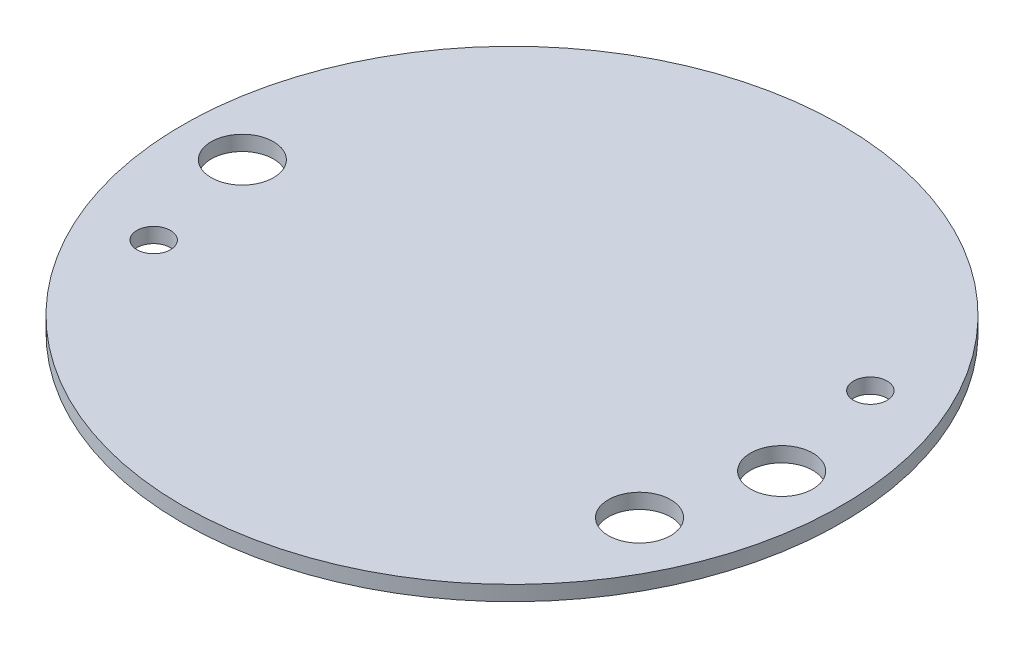
ISO-10303-21;
HEADER;
FILE_DESCRIPTION(('STEP AP214'),'2;1');
FILE_NAME('part.step','',(''),(''),'','','');
FILE_SCHEMA(('AUTOMOTIVE_DESIGN { 1 0 10303 214 1 1 1 1 }'));
ENDSEC;
DATA;
#1=APPLICATION_CONTEXT('core data for automotive mechanical design processes');
#2=APPLICATION_PROTOCOL_DEFINITION('international standard','automotive_design',2000,#1);
#3=PRODUCT_CONTEXT('',#1,'mechanical');
#4=PRODUCT('Part','Part','',(#3));
#5=PRODUCT_RELATED_PRODUCT_CATEGORY('part','',(#4));
#6=PRODUCT_DEFINITION_FORMATION('','',#4);
#7=PRODUCT_DEFINITION_CONTEXT('part definition',#1,'design');
#8=PRODUCT_DEFINITION('design','',#6,#7);
#9=PRODUCT_DEFINITION_SHAPE('','',#8);
#10=(LENGTH_UNIT() NAMED_UNIT(*) SI_UNIT(.MILLI.,.METRE.));
#11=(NAMED_UNIT(*) PLANE_ANGLE_UNIT() SI_UNIT($,.RADIAN.));
#12=(NAMED_UNIT(*) SI_UNIT($,.STERADIAN.) SOLID_ANGLE_UNIT());
#13=UNCERTAINTY_MEASURE_WITH_UNIT(LENGTH_MEASURE(1.E-05),#10,'distance_accuracy_value','');
#14=(GEOMETRIC_REPRESENTATION_CONTEXT(3) GLOBAL_UNCERTAINTY_ASSIGNED_CONTEXT((#13)) GLOBAL_UNIT_ASSIGNED_CONTEXT((#10,
#11,#12)) REPRESENTATION_CONTEXT('',''));
#15=CARTESIAN_POINT('',(0.,0.,0.));
#16=DIRECTION('',(0.,0.,1.));
#17=DIRECTION('',(1.,0.,0.));
#18=AXIS2_PLACEMENT_3D('',#15,#16,#17);
#19=CARTESIAN_POINT('',(0.,3.175,0.));
#20=DIRECTION('',(0.,-1.,0.));
#21=DIRECTION('',(0.,0.,-1.));
#22=AXIS2_PLACEMENT_3D('',#19,#20,#21);
#23=CYLINDRICAL_SURFACE('',#22,69.85);
#24=CARTESIAN_POINT('',(0.,3.175,0.));
#25=DIRECTION('',(0.,1.,0.));
#26=DIRECTION('',(0.,0.,1.));
#27=AXIS2_PLACEMENT_3D('',#24,#25,#26);
#28=CIRCLE('',#27,69.85);
#29=CARTESIAN_POINT('',(0.,3.175,69.85));
#30=VERTEX_POINT('',#29);
#31=EDGE_CURVE('E10',#30,#30,#28,.T.);
#32=ORIENTED_EDGE('',*,*,#31,.F.);
#33=EDGE_LOOP('',(#32));
#34=FACE_BOUND('',#33,.T.);
#35=CARTESIAN_POINT('',(0.,0.,0.));
#36=DIRECTION('',(0.,1.,0.));
#37=DIRECTION('',(0.,0.,1.));
#38=AXIS2_PLACEMENT_3D('',#35,#36,#37);
#39=CIRCLE('',#38,69.85);
#40=CARTESIAN_POINT('',(0.,0.,69.85));
#41=VERTEX_POINT('',#40);
#42=EDGE_CURVE('E42',#41,#41,#39,.T.);
#43=ORIENTED_EDGE('',*,*,#42,.T.);
#44=EDGE_LOOP('',(#43));
#45=FACE_BOUND('',#44,.T.);
#46=ADVANCED_FACE('F39',(#34,#45),#23,.T.);
#47=CARTESIAN_POINT('',(0.,3.175,0.));
#48=DIRECTION('',(0.,1.,0.));
#49=DIRECTION('',(0.,0.,1.));
#50=AXIS2_PLACEMENT_3D('',#47,#48,#49);
#51=PLANE('',#50);
#52=CARTESIAN_POINT('',(-57.15,3.175,0.));
#53=DIRECTION('',(0.,1.,0.));
#54=DIRECTION('',(0.,0.,1.));
#55=AXIS2_PLACEMENT_3D('',#52,#53,#54);
#56=CIRCLE('',#55,6.604);
#57=CARTESIAN_POINT('',(-57.15,3.175,6.60400000000001));
#58=VERTEX_POINT('',#57);
#59=EDGE_CURVE('E54',#58,#58,#56,.T.);
#60=ORIENTED_EDGE('',*,*,#59,.F.);
#61=EDGE_LOOP('',(#60));
#62=FACE_BOUND('',#61,.T.);
#63=CARTESIAN_POINT('',(57.15,3.175,0.));
#64=DIRECTION('',(0.,1.,0.));
#65=DIRECTION('',(0.,0.,1.));
#66=AXIS2_PLACEMENT_3D('',#63,#64,#65);
#67=CIRCLE('',#66,6.604);
#68=CARTESIAN_POINT('',(57.15,3.175,6.60399999999998));
#69=VERTEX_POINT('',#68);
#70=EDGE_CURVE('E60',#69,#69,#67,.T.);
#71=ORIENTED_EDGE('',*,*,#70,.F.);
#72=EDGE_LOOP('',(#71));
#73=FACE_BOUND('',#72,.T.);
#74=CARTESIAN_POINT('',(51.7954900291446,3.175,-24.152633658481));
#75=DIRECTION('',(0.,1.,0.));
#76=DIRECTION('',(0.,0.,1.));
#77=AXIS2_PLACEMENT_3D('',#74,#75,#76);
#78=CIRCLE('',#77,3.55600000000001);
#79=CARTESIAN_POINT('',(51.7954900291446,3.175,-20.596633658481));
#80=VERTEX_POINT('',#79);
#81=EDGE_CURVE('E61',#80,#80,#78,.T.);
#82=ORIENTED_EDGE('',*,*,#81,.F.);
#83=EDGE_LOOP('',(#82));
#84=FACE_BOUND('',#83,.T.);
#85=CARTESIAN_POINT('',(50.644479139608,3.175,23.6159084660704));
#86=DIRECTION('',(0.,1.,0.));
#87=DIRECTION('',(0.,0.,1.));
#88=AXIS2_PLACEMENT_3D('',#85,#86,#87);
#89=CIRCLE('',#88,6.604);
#90=CARTESIAN_POINT('',(50.644479139608,3.175,30.2199084660704));
#91=VERTEX_POINT('',#90);
#92=EDGE_CURVE('E72',#91,#91,#89,.T.);
#93=ORIENTED_EDGE('',*,*,#92,.F.);
#94=EDGE_LOOP('',(#93));
#95=FACE_BOUND('',#94,.T.);
#96=CARTESIAN_POINT('',(-51.7954900291446,3.175,24.1526336584811));
#97=DIRECTION('',(0.,1.,0.));
#98=DIRECTION('',(0.,0.,1.));
#99=AXIS2_PLACEMENT_3D('',#96,#97,#98);
#100=CIRCLE('',#99,3.55600000000001);
#101=CARTESIAN_POINT('',(-51.7954900291446,3.175,27.7086336584811));
#102=VERTEX_POINT('',#101);
#103=EDGE_CURVE('E51',#102,#102,#100,.T.);
#104=ORIENTED_EDGE('',*,*,#103,.F.);
#105=EDGE_LOOP('',(#104));
#106=FACE_BOUND('',#105,.T.);
#107=ORIENTED_EDGE('',*,*,#31,.T.);
#108=EDGE_LOOP('',(#107));
#109=FACE_BOUND('',#108,.T.);
#110=ADVANCED_FACE('F83',(#62,#73,#84,#95,#106,#109),#51,.T.);
#111=CARTESIAN_POINT('',(0.,0.,0.));
#112=DIRECTION('',(0.,1.,0.));
#113=DIRECTION('',(0.,0.,1.));
#114=AXIS2_PLACEMENT_3D('',#111,#112,#113);
#115=PLANE('',#114);
#116=CARTESIAN_POINT('',(-57.15,0.,0.));
#117=DIRECTION('',(0.,1.,0.));
#118=DIRECTION('',(0.,0.,1.));
#119=AXIS2_PLACEMENT_3D('',#116,#117,#118);
#120=CIRCLE('',#119,6.604);
#121=CARTESIAN_POINT('',(-57.15,0.,6.60400000000001));
#122=VERTEX_POINT('',#121);
#123=EDGE_CURVE('E64',#122,#122,#120,.T.);
#124=ORIENTED_EDGE('',*,*,#123,.T.);
#125=EDGE_LOOP('',(#124));
#126=FACE_BOUND('',#125,.T.);
#127=CARTESIAN_POINT('',(57.15,0.,0.));
#128=DIRECTION('',(0.,1.,0.));
#129=DIRECTION('',(0.,0.,1.));
#130=AXIS2_PLACEMENT_3D('',#127,#128,#129);
#131=CIRCLE('',#130,6.604);
#132=CARTESIAN_POINT('',(57.15,0.,6.60399999999998));
#133=VERTEX_POINT('',#132);
#134=EDGE_CURVE('E57',#133,#133,#131,.T.);
#135=ORIENTED_EDGE('',*,*,#134,.T.);
#136=EDGE_LOOP('',(#135));
#137=FACE_BOUND('',#136,.T.);
#138=CARTESIAN_POINT('',(51.7954900291446,0.,-24.152633658481));
#139=DIRECTION('',(0.,1.,0.));
#140=DIRECTION('',(0.,0.,1.));
#141=AXIS2_PLACEMENT_3D('',#138,#139,#140);
#142=CIRCLE('',#141,3.55600000000001);
#143=CARTESIAN_POINT('',(51.7954900291446,0.,-20.596633658481));
#144=VERTEX_POINT('',#143);
#145=EDGE_CURVE('E75',#144,#144,#142,.T.);
#146=ORIENTED_EDGE('',*,*,#145,.T.);
#147=EDGE_LOOP('',(#146));
#148=FACE_BOUND('',#147,.T.);
#149=CARTESIAN_POINT('',(50.644479139608,0.,23.6159084660704));
#150=DIRECTION('',(0.,1.,0.));
#151=DIRECTION('',(0.,0.,1.));
#152=AXIS2_PLACEMENT_3D('',#149,#150,#151);
#153=CIRCLE('',#152,6.604);
#154=CARTESIAN_POINT('',(50.644479139608,0.,30.2199084660704));
#155=VERTEX_POINT('',#154);
#156=EDGE_CURVE('E69',#155,#155,#153,.T.);
#157=ORIENTED_EDGE('',*,*,#156,.T.);
#158=EDGE_LOOP('',(#157));
#159=FACE_BOUND('',#158,.T.);
#160=CARTESIAN_POINT('',(-51.7954900291446,0.,24.1526336584811));
#161=DIRECTION('',(0.,1.,0.));
#162=DIRECTION('',(0.,0.,1.));
#163=AXIS2_PLACEMENT_3D('',#160,#161,#162);
#164=CIRCLE('',#163,3.55600000000001);
#165=CARTESIAN_POINT('',(-51.7954900291446,0.,27.7086336584811));
#166=VERTEX_POINT('',#165);
#167=EDGE_CURVE('E49',#166,#166,#164,.T.);
#168=ORIENTED_EDGE('',*,*,#167,.T.);
#169=EDGE_LOOP('',(#168));
#170=FACE_BOUND('',#169,.T.);
#171=ORIENTED_EDGE('',*,*,#42,.F.);
#172=EDGE_LOOP('',(#171));
#173=FACE_BOUND('',#172,.T.);
#174=ADVANCED_FACE('F86',(#126,#137,#148,#159,#170,#173),#115,.F.);
#175=CARTESIAN_POINT('',(-51.7954900291446,0.,24.1526336584811));
#176=DIRECTION('',(0.,1.,0.));
#177=DIRECTION('',(0.,0.,1.));
#178=AXIS2_PLACEMENT_3D('',#175,#176,#177);
#179=CYLINDRICAL_SURFACE('',#178,3.55600000000001);
#180=ORIENTED_EDGE('',*,*,#167,.F.);
#181=EDGE_LOOP('',(#180));
#182=FACE_BOUND('',#181,.T.);
#183=ORIENTED_EDGE('',*,*,#103,.T.);
#184=EDGE_LOOP('',(#183));
#185=FACE_BOUND('',#184,.T.);
#186=ADVANCED_FACE('F93',(#182,#185),#179,.F.);
#187=CARTESIAN_POINT('',(50.644479139608,0.,23.6159084660704));
#188=DIRECTION('',(0.,1.,0.));
#189=DIRECTION('',(0.,0.,1.));
#190=AXIS2_PLACEMENT_3D('',#187,#188,#189);
#191=CYLINDRICAL_SURFACE('',#190,6.604);
#192=ORIENTED_EDGE('',*,*,#156,.F.);
#193=EDGE_LOOP('',(#192));
#194=FACE_BOUND('',#193,.T.);
#195=ORIENTED_EDGE('',*,*,#92,.T.);
#196=EDGE_LOOP('',(#195));
#197=FACE_BOUND('',#196,.T.);
#198=ADVANCED_FACE('F95',(#194,#197),#191,.F.);
#199=CARTESIAN_POINT('',(51.7954900291446,0.,-24.152633658481));
#200=DIRECTION('',(0.,1.,0.));
#201=DIRECTION('',(0.,0.,1.));
#202=AXIS2_PLACEMENT_3D('',#199,#200,#201);
#203=CYLINDRICAL_SURFACE('',#202,3.55600000000001);
#204=ORIENTED_EDGE('',*,*,#145,.F.);
#205=EDGE_LOOP('',(#204));
#206=FACE_BOUND('',#205,.T.);
#207=ORIENTED_EDGE('',*,*,#81,.T.);
#208=EDGE_LOOP('',(#207));
#209=FACE_BOUND('',#208,.T.);
#210=ADVANCED_FACE('F81',(#206,#209),#203,.F.);
#211=CARTESIAN_POINT('',(57.15,0.,0.));
#212=DIRECTION('',(0.,1.,0.));
#213=DIRECTION('',(0.,0.,1.));
#214=AXIS2_PLACEMENT_3D('',#211,#212,#213);
#215=CYLINDRICAL_SURFACE('',#214,6.604);
#216=ORIENTED_EDGE('',*,*,#134,.F.);
#217=EDGE_LOOP('',(#216));
#218=FACE_BOUND('',#217,.T.);
#219=ORIENTED_EDGE('',*,*,#70,.T.);
#220=EDGE_LOOP('',(#219));
#221=FACE_BOUND('',#220,.T.);
#222=ADVANCED_FACE('F144',(#218,#221),#215,.F.);
#223=CARTESIAN_POINT('',(-57.15,0.,0.));
#224=DIRECTION('',(0.,1.,0.));
#225=DIRECTION('',(0.,0.,1.));
#226=AXIS2_PLACEMENT_3D('',#223,#224,#225);
#227=CYLINDRICAL_SURFACE('',#226,6.604);
#228=ORIENTED_EDGE('',*,*,#123,.F.);
#229=EDGE_LOOP('',(#228));
#230=FACE_BOUND('',#229,.T.);
#231=ORIENTED_EDGE('',*,*,#59,.T.);
#232=EDGE_LOOP('',(#231));
#233=FACE_BOUND('',#232,.T.);
#234=ADVANCED_FACE('F154',(#230,#233),#227,.F.);
#235=CLOSED_SHELL('',(#46,#110,#174,#186,#198,#210,#222,#234));
#236=MANIFOLD_SOLID_BREP('B2',#235);
#237=ADVANCED_BREP_SHAPE_REPRESENTATION('',(#18,#236),#14);
#238=SHAPE_DEFINITION_REPRESENTATION(#9,#237);
ENDSEC;
END-ISO-10303-21;
